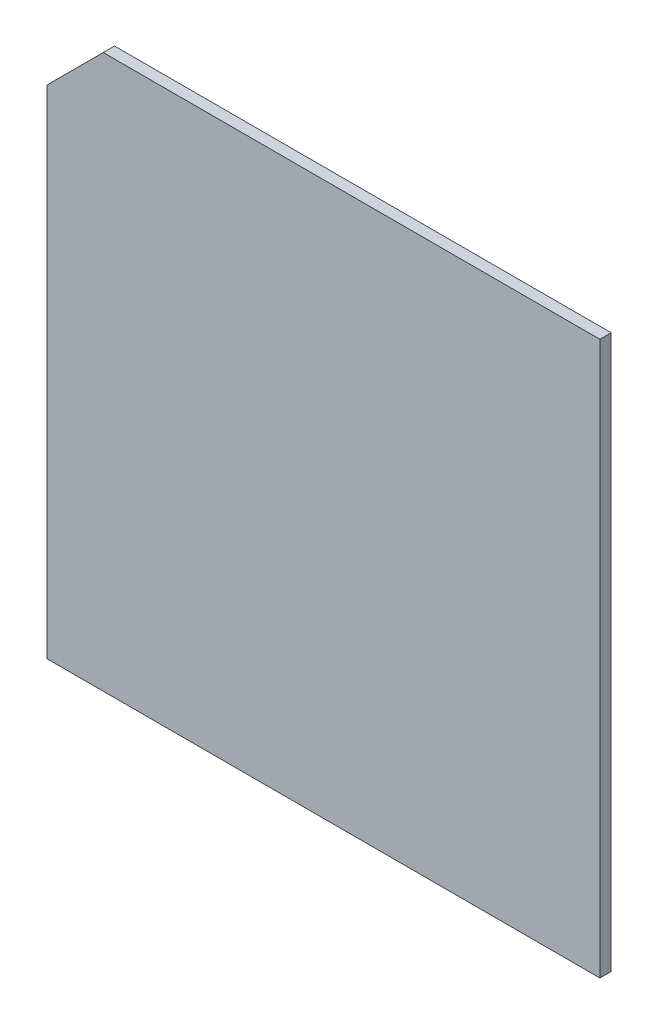
ISO-10303-21;
HEADER;
FILE_DESCRIPTION(('STEP AP214'),'2;1');
FILE_NAME('part.step','',(''),(''),'','','');
FILE_SCHEMA(('AUTOMOTIVE_DESIGN { 1 0 10303 214 1 1 1 1 }'));
ENDSEC;
DATA;
#1=APPLICATION_CONTEXT('core data for automotive mechanical design processes');
#2=APPLICATION_PROTOCOL_DEFINITION('international standard','automotive_design',2000,#1);
#3=PRODUCT_CONTEXT('',#1,'mechanical');
#4=PRODUCT('Part','Part','',(#3));
#5=PRODUCT_RELATED_PRODUCT_CATEGORY('part','',(#4));
#6=PRODUCT_DEFINITION_FORMATION('','',#4);
#7=PRODUCT_DEFINITION_CONTEXT('part definition',#1,'design');
#8=PRODUCT_DEFINITION('design','',#6,#7);
#9=PRODUCT_DEFINITION_SHAPE('','',#8);
#10=(LENGTH_UNIT() NAMED_UNIT(*) SI_UNIT(.MILLI.,.METRE.));
#11=(NAMED_UNIT(*) PLANE_ANGLE_UNIT() SI_UNIT($,.RADIAN.));
#12=(NAMED_UNIT(*) SI_UNIT($,.STERADIAN.) SOLID_ANGLE_UNIT());
#13=UNCERTAINTY_MEASURE_WITH_UNIT(LENGTH_MEASURE(1.E-05),#10,'distance_accuracy_value','');
#14=(GEOMETRIC_REPRESENTATION_CONTEXT(3) GLOBAL_UNCERTAINTY_ASSIGNED_CONTEXT((#13)) GLOBAL_UNIT_ASSIGNED_CONTEXT((#10,
#11,#12)) REPRESENTATION_CONTEXT('',''));
#15=CARTESIAN_POINT('',(0.,0.,0.));
#16=DIRECTION('',(0.,0.,1.));
#17=DIRECTION('',(1.,0.,0.));
#18=AXIS2_PLACEMENT_3D('',#15,#16,#17);
#19=CARTESIAN_POINT('',(0.,0.,1.));
#20=DIRECTION('',(0.,1.,0.));
#21=DIRECTION('',(0.,0.,1.));
#22=AXIS2_PLACEMENT_3D('',#19,#20,#21);
#23=PLANE('',#22);
#24=DIRECTION('',(1.,0.,0.));
#25=VECTOR('',#24,1.);
#26=CARTESIAN_POINT('',(0.,0.,0.));
#27=LINE('',#26,#25);
#28=CARTESIAN_POINT('',(-49.,0.,0.));
#29=VERTEX_POINT('',#28);
#30=CARTESIAN_POINT('',(0.,0.,0.));
#31=VERTEX_POINT('',#30);
#32=EDGE_CURVE('E113',#29,#31,#27,.T.);
#33=ORIENTED_EDGE('',*,*,#32,.T.);
#34=DIRECTION('',(0.,0.,-1.));
#35=VECTOR('',#34,1.);
#36=CARTESIAN_POINT('',(0.,0.,1.));
#37=LINE('',#36,#35);
#38=CARTESIAN_POINT('',(0.,0.,1.));
#39=VERTEX_POINT('',#38);
#40=EDGE_CURVE('E11',#39,#31,#37,.T.);
#41=ORIENTED_EDGE('',*,*,#40,.F.);
#42=DIRECTION('',(1.,0.,0.));
#43=VECTOR('',#42,1.);
#44=CARTESIAN_POINT('',(0.,0.,1.));
#45=LINE('',#44,#43);
#46=CARTESIAN_POINT('',(-49.,0.,1.));
#47=VERTEX_POINT('',#46);
#48=EDGE_CURVE('E121',#47,#39,#45,.T.);
#49=ORIENTED_EDGE('',*,*,#48,.F.);
#50=DIRECTION('',(0.,0.,-1.));
#51=VECTOR('',#50,1.);
#52=CARTESIAN_POINT('',(-49.,0.,1.));
#53=LINE('',#52,#51);
#54=EDGE_CURVE('E109',#47,#29,#53,.T.);
#55=ORIENTED_EDGE('',*,*,#54,.T.);
#56=EDGE_LOOP('',(#33,#41,#49,#55));
#57=FACE_BOUND('',#56,.T.);
#58=ADVANCED_FACE('F39',(#57),#23,.F.);
#59=CARTESIAN_POINT('',(0.,0.,1.));
#60=DIRECTION('',(-1.,0.,0.));
#61=DIRECTION('',(0.,0.,1.));
#62=AXIS2_PLACEMENT_3D('',#59,#60,#61);
#63=PLANE('',#62);
#64=DIRECTION('',(0.,1.,0.));
#65=VECTOR('',#64,1.);
#66=CARTESIAN_POINT('',(0.,0.,0.));
#67=LINE('',#66,#65);
#68=CARTESIAN_POINT('',(0.,49.,0.));
#69=VERTEX_POINT('',#68);
#70=EDGE_CURVE('E116',#31,#69,#67,.T.);
#71=ORIENTED_EDGE('',*,*,#70,.T.);
#72=DIRECTION('',(0.,0.,-1.));
#73=VECTOR('',#72,1.);
#74=CARTESIAN_POINT('',(0.,49.,1.));
#75=LINE('',#74,#73);
#76=CARTESIAN_POINT('',(0.,49.,1.));
#77=VERTEX_POINT('',#76);
#78=EDGE_CURVE('E47',#77,#69,#75,.T.);
#79=ORIENTED_EDGE('',*,*,#78,.F.);
#80=DIRECTION('',(0.,1.,0.));
#81=VECTOR('',#80,1.);
#82=CARTESIAN_POINT('',(0.,0.,1.));
#83=LINE('',#82,#81);
#84=EDGE_CURVE('E89',#39,#77,#83,.T.);
#85=ORIENTED_EDGE('',*,*,#84,.F.);
#86=ORIENTED_EDGE('',*,*,#40,.T.);
#87=EDGE_LOOP('',(#71,#79,#85,#86));
#88=FACE_BOUND('',#87,.T.);
#89=ADVANCED_FACE('F140',(#88),#63,.F.);
#90=CARTESIAN_POINT('',(0.,49.,1.));
#91=DIRECTION('',(0.,-1.,0.));
#92=DIRECTION('',(0.,0.,-1.));
#93=AXIS2_PLACEMENT_3D('',#90,#91,#92);
#94=PLANE('',#93);
#95=DIRECTION('',(-1.,0.,0.));
#96=VECTOR('',#95,1.);
#97=CARTESIAN_POINT('',(0.,49.,0.));
#98=LINE('',#97,#96);
#99=CARTESIAN_POINT('',(-44.,49.,0.));
#100=VERTEX_POINT('',#99);
#101=EDGE_CURVE('E104',#69,#100,#98,.T.);
#102=ORIENTED_EDGE('',*,*,#101,.T.);
#103=DIRECTION('',(0.,0.,-1.));
#104=VECTOR('',#103,1.);
#105=CARTESIAN_POINT('',(-44.,49.,1.));
#106=LINE('',#105,#104);
#107=CARTESIAN_POINT('',(-44.,49.,1.));
#108=VERTEX_POINT('',#107);
#109=EDGE_CURVE('E101',#108,#100,#106,.T.);
#110=ORIENTED_EDGE('',*,*,#109,.F.);
#111=DIRECTION('',(-1.,0.,0.));
#112=VECTOR('',#111,1.);
#113=CARTESIAN_POINT('',(0.,49.,1.));
#114=LINE('',#113,#112);
#115=EDGE_CURVE('E93',#77,#108,#114,.T.);
#116=ORIENTED_EDGE('',*,*,#115,.F.);
#117=ORIENTED_EDGE('',*,*,#78,.T.);
#118=EDGE_LOOP('',(#102,#110,#116,#117));
#119=FACE_BOUND('',#118,.T.);
#120=ADVANCED_FACE('F102',(#119),#94,.F.);
#121=CARTESIAN_POINT('',(-49.,44.,1.));
#122=DIRECTION('',(0.707106781186547,-0.707106781186547,0.));
#123=DIRECTION('',(0.707106781186548,0.707106781186548,0.));
#124=AXIS2_PLACEMENT_3D('',#121,#122,#123);
#125=PLANE('',#124);
#126=DIRECTION('',(-0.707106781186547,-0.707106781186547,0.));
#127=VECTOR('',#126,1.);
#128=CARTESIAN_POINT('',(-49.,44.,0.));
#129=LINE('',#128,#127);
#130=CARTESIAN_POINT('',(-49.,44.,0.));
#131=VERTEX_POINT('',#130);
#132=EDGE_CURVE('E75',#100,#131,#129,.T.);
#133=ORIENTED_EDGE('',*,*,#132,.T.);
#134=DIRECTION('',(0.,0.,-1.));
#135=VECTOR('',#134,1.);
#136=CARTESIAN_POINT('',(-49.,44.,1.));
#137=LINE('',#136,#135);
#138=CARTESIAN_POINT('',(-49.,44.,1.));
#139=VERTEX_POINT('',#138);
#140=EDGE_CURVE('E105',#139,#131,#137,.T.);
#141=ORIENTED_EDGE('',*,*,#140,.F.);
#142=DIRECTION('',(-0.707106781186547,-0.707106781186547,0.));
#143=VECTOR('',#142,1.);
#144=CARTESIAN_POINT('',(-49.,44.,1.));
#145=LINE('',#144,#143);
#146=EDGE_CURVE('E97',#108,#139,#145,.T.);
#147=ORIENTED_EDGE('',*,*,#146,.F.);
#148=ORIENTED_EDGE('',*,*,#109,.T.);
#149=EDGE_LOOP('',(#133,#141,#147,#148));
#150=FACE_BOUND('',#149,.T.);
#151=ADVANCED_FACE('F107',(#150),#125,.F.);
#152=CARTESIAN_POINT('',(-49.,0.,1.));
#153=DIRECTION('',(1.,0.,0.));
#154=DIRECTION('',(0.,0.,-1.));
#155=AXIS2_PLACEMENT_3D('',#152,#153,#154);
#156=PLANE('',#155);
#157=DIRECTION('',(0.,-1.,0.));
#158=VECTOR('',#157,1.);
#159=CARTESIAN_POINT('',(-49.,0.,0.));
#160=LINE('',#159,#158);
#161=EDGE_CURVE('E81',#131,#29,#160,.T.);
#162=ORIENTED_EDGE('',*,*,#161,.T.);
#163=ORIENTED_EDGE('',*,*,#54,.F.);
#164=DIRECTION('',(0.,-1.,0.));
#165=VECTOR('',#164,1.);
#166=CARTESIAN_POINT('',(-49.,0.,1.));
#167=LINE('',#166,#165);
#168=EDGE_CURVE('E55',#139,#47,#167,.T.);
#169=ORIENTED_EDGE('',*,*,#168,.F.);
#170=ORIENTED_EDGE('',*,*,#140,.T.);
#171=EDGE_LOOP('',(#162,#163,#169,#170));
#172=FACE_BOUND('',#171,.T.);
#173=ADVANCED_FACE('F129',(#172),#156,.F.);
#174=CARTESIAN_POINT('',(0.,0.,1.));
#175=DIRECTION('',(0.,0.,-1.));
#176=DIRECTION('',(-1.,0.,0.));
#177=AXIS2_PLACEMENT_3D('',#174,#175,#176);
#178=PLANE('',#177);
#179=ORIENTED_EDGE('',*,*,#48,.T.);
#180=ORIENTED_EDGE('',*,*,#84,.T.);
#181=ORIENTED_EDGE('',*,*,#115,.T.);
#182=ORIENTED_EDGE('',*,*,#146,.T.);
#183=ORIENTED_EDGE('',*,*,#168,.T.);
#184=EDGE_LOOP('',(#179,#180,#181,#182,#183));
#185=FACE_BOUND('',#184,.T.);
#186=ADVANCED_FACE('F95',(#185),#178,.F.);
#187=CARTESIAN_POINT('',(0.,0.,0.));
#188=DIRECTION('',(0.,0.,-1.));
#189=DIRECTION('',(-1.,0.,0.));
#190=AXIS2_PLACEMENT_3D('',#187,#188,#189);
#191=PLANE('',#190);
#192=ORIENTED_EDGE('',*,*,#32,.F.);
#193=ORIENTED_EDGE('',*,*,#161,.F.);
#194=ORIENTED_EDGE('',*,*,#132,.F.);
#195=ORIENTED_EDGE('',*,*,#101,.F.);
#196=ORIENTED_EDGE('',*,*,#70,.F.);
#197=EDGE_LOOP('',(#192,#193,#194,#195,#196));
#198=FACE_BOUND('',#197,.T.);
#199=ADVANCED_FACE('F125',(#198),#191,.T.);
#200=CLOSED_SHELL('',(#58,#89,#120,#151,#173,#186,#199));
#201=MANIFOLD_SOLID_BREP('B2',#200);
#202=ADVANCED_BREP_SHAPE_REPRESENTATION('',(#18,#201),#14);
#203=SHAPE_DEFINITION_REPRESENTATION(#9,#202);
ENDSEC;
END-ISO-10303-21;
